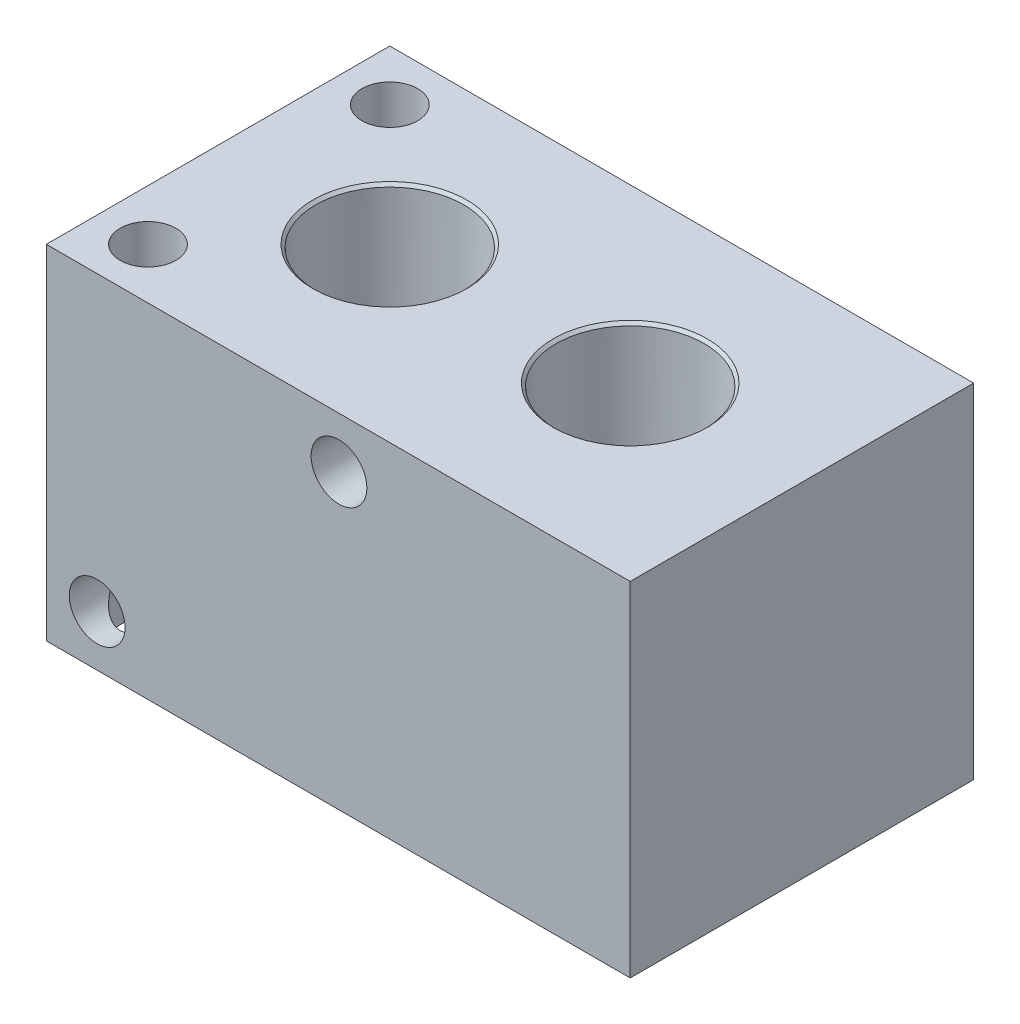
ISO-10303-21;
HEADER;
FILE_DESCRIPTION(('STEP AP214'),'2;1');
FILE_NAME('part.step','',(''),(''),'','','');
FILE_SCHEMA(('AUTOMOTIVE_DESIGN { 1 0 10303 214 1 1 1 1 }'));
ENDSEC;
DATA;
#1=APPLICATION_CONTEXT('core data for automotive mechanical design processes');
#2=APPLICATION_PROTOCOL_DEFINITION('international standard','automotive_design',2000,#1);
#3=PRODUCT_CONTEXT('',#1,'mechanical');
#4=PRODUCT('Part','Part','',(#3));
#5=PRODUCT_RELATED_PRODUCT_CATEGORY('part','',(#4));
#6=PRODUCT_DEFINITION_FORMATION('','',#4);
#7=PRODUCT_DEFINITION_CONTEXT('part definition',#1,'design');
#8=PRODUCT_DEFINITION('design','',#6,#7);
#9=PRODUCT_DEFINITION_SHAPE('','',#8);
#10=(LENGTH_UNIT() NAMED_UNIT(*) SI_UNIT(.MILLI.,.METRE.));
#11=(NAMED_UNIT(*) PLANE_ANGLE_UNIT() SI_UNIT($,.RADIAN.));
#12=(NAMED_UNIT(*) SI_UNIT($,.STERADIAN.) SOLID_ANGLE_UNIT());
#13=UNCERTAINTY_MEASURE_WITH_UNIT(LENGTH_MEASURE(1.E-05),#10,'distance_accuracy_value','');
#14=(GEOMETRIC_REPRESENTATION_CONTEXT(3) GLOBAL_UNCERTAINTY_ASSIGNED_CONTEXT((#13)) GLOBAL_UNIT_ASSIGNED_CONTEXT((#10,
#11,#12)) REPRESENTATION_CONTEXT('',''));
#15=CARTESIAN_POINT('',(0.,0.,0.));
#16=DIRECTION('',(0.,0.,1.));
#17=DIRECTION('',(1.,0.,0.));
#18=AXIS2_PLACEMENT_3D('',#15,#16,#17);
#19=CARTESIAN_POINT('',(-22.2885,-11.176,15.875));
#20=DIRECTION('',(0.,0.,-1.));
#21=DIRECTION('',(-1.,0.,0.));
#22=AXIS2_PLACEMENT_3D('',#19,#20,#21);
#23=CYLINDRICAL_SURFACE('',#22,2.5781);
#24=CARTESIAN_POINT('',(-22.2885,-11.176,-11.176));
#25=DIRECTION('',(0.,0.707106781186547,-0.707106781186547));
#26=DIRECTION('',(0.,-0.707106781186547,-0.707106781186547));
#27=AXIS2_PLACEMENT_3D('',#24,#25,#26);
#28=ELLIPSE('',#27,3.64598398515408,2.5781);
#29=CARTESIAN_POINT('',(-19.7104,-11.176,-11.176));
#30=VERTEX_POINT('',#29);
#31=CARTESIAN_POINT('',(-24.8666,-11.176,-11.176));
#32=VERTEX_POINT('',#31);
#33=EDGE_CURVE('E11',#30,#32,#28,.F.);
#34=ORIENTED_EDGE('',*,*,#33,.F.);
#35=CARTESIAN_POINT('',(-22.2885,-11.176,-11.176));
#36=DIRECTION('',(0.,-0.707106781186547,-0.707106781186547));
#37=DIRECTION('',(0.,0.707106781186547,-0.707106781186547));
#38=AXIS2_PLACEMENT_3D('',#35,#36,#37);
#39=ELLIPSE('',#38,3.64598398515408,2.5781);
#40=EDGE_CURVE('E50',#32,#30,#39,.F.);
#41=ORIENTED_EDGE('',*,*,#40,.F.);
#42=EDGE_LOOP('',(#34,#41));
#43=FACE_BOUND('',#42,.T.);
#44=CARTESIAN_POINT('',(-22.2885,-11.176,11.176));
#45=DIRECTION('',(0.,0.707106781186547,-0.707106781186547));
#46=DIRECTION('',(0.,-0.707106781186547,-0.707106781186547));
#47=AXIS2_PLACEMENT_3D('',#44,#45,#46);
#48=ELLIPSE('',#47,3.64598398515408,2.5781);
#49=CARTESIAN_POINT('',(-19.7104,-11.176,11.176));
#50=VERTEX_POINT('',#49);
#51=CARTESIAN_POINT('',(-24.8666,-11.176,11.176));
#52=VERTEX_POINT('',#51);
#53=EDGE_CURVE('E263',#50,#52,#48,.T.);
#54=ORIENTED_EDGE('',*,*,#53,.F.);
#55=CARTESIAN_POINT('',(-22.2885,-11.176,11.176));
#56=DIRECTION('',(0.,-0.707106781186547,-0.707106781186547));
#57=DIRECTION('',(0.,0.707106781186547,-0.707106781186547));
#58=AXIS2_PLACEMENT_3D('',#55,#56,#57);
#59=ELLIPSE('',#58,3.64598398515408,2.5781);
#60=EDGE_CURVE('E261',#52,#50,#59,.T.);
#61=ORIENTED_EDGE('',*,*,#60,.F.);
#62=EDGE_LOOP('',(#54,#61));
#63=FACE_BOUND('',#62,.T.);
#64=ADVANCED_FACE('F36',(#43,#63),#23,.F.);
#65=CARTESIAN_POINT('',(-22.2885,-11.176,11.176));
#66=DIRECTION('',(0.,0.707106781186547,-0.707106781186547));
#67=DIRECTION('',(0.,-0.707106781186547,-0.707106781186547));
#68=AXIS2_PLACEMENT_3D('',#65,#66,#67);
#69=ELLIPSE('',#68,3.64598398515408,2.5781);
#70=EDGE_CURVE('E265',#50,#52,#69,.F.);
#71=ORIENTED_EDGE('',*,*,#70,.F.);
#72=CARTESIAN_POINT('',(-22.2885,-11.176,11.176));
#73=DIRECTION('',(0.,-0.707106781186547,-0.707106781186547));
#74=DIRECTION('',(0.,0.707106781186547,-0.707106781186547));
#75=AXIS2_PLACEMENT_3D('',#72,#73,#74);
#76=ELLIPSE('',#75,3.64598398515408,2.5781);
#77=EDGE_CURVE('E57',#52,#50,#76,.F.);
#78=ORIENTED_EDGE('',*,*,#77,.F.);
#79=EDGE_LOOP('',(#71,#78));
#80=FACE_BOUND('',#79,.T.);
#81=CARTESIAN_POINT('',(-22.2885,-11.176,15.875));
#82=DIRECTION('',(0.,0.,1.));
#83=DIRECTION('',(1.,0.,0.));
#84=AXIS2_PLACEMENT_3D('',#81,#82,#83);
#85=CIRCLE('',#84,2.5781);
#86=CARTESIAN_POINT('',(-19.7104,-11.176,15.875));
#87=VERTEX_POINT('',#86);
#88=EDGE_CURVE('E219',#87,#87,#85,.T.);
#89=ORIENTED_EDGE('',*,*,#88,.T.);
#90=EDGE_LOOP('',(#89));
#91=FACE_BOUND('',#90,.T.);
#92=ADVANCED_FACE('F285',(#80,#91),#23,.F.);
#93=CARTESIAN_POINT('',(-26.9875,-15.875,15.875));
#94=DIRECTION('',(0.,0.,1.));
#95=DIRECTION('',(1.,0.,0.));
#96=AXIS2_PLACEMENT_3D('',#93,#94,#95);
#97=PLANE('',#96);
#98=CARTESIAN_POINT('',(0.0634999999999976,11.176,15.875));
#99=DIRECTION('',(0.,0.,1.));
#100=DIRECTION('',(1.,0.,0.));
#101=AXIS2_PLACEMENT_3D('',#98,#99,#100);
#102=CIRCLE('',#101,2.5781);
#103=CARTESIAN_POINT('',(2.6416,11.176,15.875));
#104=VERTEX_POINT('',#103);
#105=EDGE_CURVE('E225',#104,#104,#102,.T.);
#106=ORIENTED_EDGE('',*,*,#105,.F.);
#107=EDGE_LOOP('',(#106));
#108=FACE_BOUND('',#107,.T.);
#109=DIRECTION('',(0.,-1.,0.));
#110=VECTOR('',#109,1.);
#111=CARTESIAN_POINT('',(-26.9875,15.875,15.875));
#112=LINE('',#111,#110);
#113=CARTESIAN_POINT('',(-26.9875,15.875,15.875));
#114=VERTEX_POINT('',#113);
#115=CARTESIAN_POINT('',(-26.9875,-15.875,15.875));
#116=VERTEX_POINT('',#115);
#117=EDGE_CURVE('E231',#114,#116,#112,.T.);
#118=ORIENTED_EDGE('',*,*,#117,.T.);
#119=DIRECTION('',(1.,0.,0.));
#120=VECTOR('',#119,1.);
#121=CARTESIAN_POINT('',(-26.9875,-15.875,15.875));
#122=LINE('',#121,#120);
#123=CARTESIAN_POINT('',(26.9875,-15.875,15.875));
#124=VERTEX_POINT('',#123);
#125=EDGE_CURVE('E234',#116,#124,#122,.T.);
#126=ORIENTED_EDGE('',*,*,#125,.T.);
#127=DIRECTION('',(0.,1.,0.));
#128=VECTOR('',#127,1.);
#129=CARTESIAN_POINT('',(26.9875,15.875,15.875));
#130=LINE('',#129,#128);
#131=CARTESIAN_POINT('',(26.9875,15.875,15.875));
#132=VERTEX_POINT('',#131);
#133=EDGE_CURVE('E237',#124,#132,#130,.T.);
#134=ORIENTED_EDGE('',*,*,#133,.T.);
#135=DIRECTION('',(-1.,0.,0.));
#136=VECTOR('',#135,1.);
#137=CARTESIAN_POINT('',(-26.9875,15.875,15.875));
#138=LINE('',#137,#136);
#139=EDGE_CURVE('E239',#132,#114,#138,.T.);
#140=ORIENTED_EDGE('',*,*,#139,.T.);
#141=EDGE_LOOP('',(#118,#126,#134,#140));
#142=FACE_BOUND('',#141,.T.);
#143=ORIENTED_EDGE('',*,*,#88,.F.);
#144=EDGE_LOOP('',(#143));
#145=FACE_BOUND('',#144,.T.);
#146=ADVANCED_FACE('F290',(#108,#142,#145),#97,.T.);
#147=CARTESIAN_POINT('',(-26.9875,-15.875,-15.875));
#148=DIRECTION('',(0.,0.,1.));
#149=DIRECTION('',(1.,0.,0.));
#150=AXIS2_PLACEMENT_3D('',#147,#148,#149);
#151=PLANE('',#150);
#152=CARTESIAN_POINT('',(0.0634999999999976,11.176,-15.875));
#153=DIRECTION('',(0.,0.,1.));
#154=DIRECTION('',(1.,0.,0.));
#155=AXIS2_PLACEMENT_3D('',#152,#153,#154);
#156=CIRCLE('',#155,2.5781);
#157=CARTESIAN_POINT('',(2.6416,11.176,-15.875));
#158=VERTEX_POINT('',#157);
#159=EDGE_CURVE('E222',#158,#158,#156,.T.);
#160=ORIENTED_EDGE('',*,*,#159,.T.);
#161=EDGE_LOOP('',(#160));
#162=FACE_BOUND('',#161,.T.);
#163=DIRECTION('',(0.,-1.,0.));
#164=VECTOR('',#163,1.);
#165=CARTESIAN_POINT('',(-26.9875,15.875,-15.875));
#166=LINE('',#165,#164);
#167=CARTESIAN_POINT('',(-26.9875,15.875,-15.875));
#168=VERTEX_POINT('',#167);
#169=CARTESIAN_POINT('',(-26.9875,-15.875,-15.875));
#170=VERTEX_POINT('',#169);
#171=EDGE_CURVE('E228',#168,#170,#166,.T.);
#172=ORIENTED_EDGE('',*,*,#171,.F.);
#173=DIRECTION('',(-1.,0.,0.));
#174=VECTOR('',#173,1.);
#175=CARTESIAN_POINT('',(-26.9875,15.875,-15.875));
#176=LINE('',#175,#174);
#177=CARTESIAN_POINT('',(26.9875,15.875,-15.875));
#178=VERTEX_POINT('',#177);
#179=EDGE_CURVE('E235',#178,#168,#176,.T.);
#180=ORIENTED_EDGE('',*,*,#179,.F.);
#181=DIRECTION('',(0.,1.,0.));
#182=VECTOR('',#181,1.);
#183=CARTESIAN_POINT('',(26.9875,15.875,-15.875));
#184=LINE('',#183,#182);
#185=CARTESIAN_POINT('',(26.9875,-15.875,-15.875));
#186=VERTEX_POINT('',#185);
#187=EDGE_CURVE('E246',#186,#178,#184,.T.);
#188=ORIENTED_EDGE('',*,*,#187,.F.);
#189=DIRECTION('',(1.,0.,0.));
#190=VECTOR('',#189,1.);
#191=CARTESIAN_POINT('',(-26.9875,-15.875,-15.875));
#192=LINE('',#191,#190);
#193=EDGE_CURVE('E244',#170,#186,#192,.T.);
#194=ORIENTED_EDGE('',*,*,#193,.F.);
#195=EDGE_LOOP('',(#172,#180,#188,#194));
#196=FACE_BOUND('',#195,.T.);
#197=CARTESIAN_POINT('',(-22.2885,-11.176,-15.875));
#198=DIRECTION('',(0.,0.,1.));
#199=DIRECTION('',(1.,0.,0.));
#200=AXIS2_PLACEMENT_3D('',#197,#198,#199);
#201=CIRCLE('',#200,2.5781);
#202=CARTESIAN_POINT('',(-19.7104,-11.176,-15.875));
#203=VERTEX_POINT('',#202);
#204=EDGE_CURVE('E216',#203,#203,#201,.T.);
#205=ORIENTED_EDGE('',*,*,#204,.T.);
#206=EDGE_LOOP('',(#205));
#207=FACE_BOUND('',#206,.T.);
#208=ADVANCED_FACE('F288',(#162,#196,#207),#151,.F.);
#209=CARTESIAN_POINT('',(-26.9875,15.875,15.875));
#210=DIRECTION('',(1.,0.,0.));
#211=DIRECTION('',(0.,1.,0.));
#212=AXIS2_PLACEMENT_3D('',#209,#210,#211);
#213=PLANE('',#212);
#214=ORIENTED_EDGE('',*,*,#171,.T.);
#215=DIRECTION('',(0.,0.,-1.));
#216=VECTOR('',#215,1.);
#217=CARTESIAN_POINT('',(-26.9875,-15.875,15.875));
#218=LINE('',#217,#216);
#219=EDGE_CURVE('E257',#116,#170,#218,.T.);
#220=ORIENTED_EDGE('',*,*,#219,.F.);
#221=ORIENTED_EDGE('',*,*,#117,.F.);
#222=DIRECTION('',(0.,0.,-1.));
#223=VECTOR('',#222,1.);
#224=CARTESIAN_POINT('',(-26.9875,15.875,15.875));
#225=LINE('',#224,#223);
#226=EDGE_CURVE('E241',#114,#168,#225,.T.);
#227=ORIENTED_EDGE('',*,*,#226,.T.);
#228=EDGE_LOOP('',(#214,#220,#221,#227));
#229=FACE_BOUND('',#228,.T.);
#230=ADVANCED_FACE('F38',(#229),#213,.F.);
#231=CARTESIAN_POINT('',(-26.9875,-15.875,15.875));
#232=DIRECTION('',(0.,1.,0.));
#233=DIRECTION('',(0.,0.,1.));
#234=AXIS2_PLACEMENT_3D('',#231,#232,#233);
#235=PLANE('',#234);
#236=CARTESIAN_POINT('',(0.,-15.875,0.));
#237=DIRECTION('',(0.,-1.,0.));
#238=DIRECTION('',(1.,0.,0.));
#239=AXIS2_PLACEMENT_3D('',#236,#237,#238);
#240=CIRCLE('',#239,8.6995);
#241=CARTESIAN_POINT('',(8.6995,-15.875,0.));
#242=VERTEX_POINT('',#241);
#243=EDGE_CURVE('E137',#242,#242,#240,.T.);
#244=ORIENTED_EDGE('',*,*,#243,.F.);
#245=EDGE_LOOP('',(#244));
#246=FACE_BOUND('',#245,.T.);
#247=CARTESIAN_POINT('',(-22.2885,-15.875,-11.176));
#248=DIRECTION('',(0.,1.,0.));
#249=DIRECTION('',(0.,0.,1.));
#250=AXIS2_PLACEMENT_3D('',#247,#248,#249);
#251=CIRCLE('',#250,2.5781);
#252=CARTESIAN_POINT('',(-22.2885,-15.875,-8.5979));
#253=VERTEX_POINT('',#252);
#254=EDGE_CURVE('E207',#253,#253,#251,.T.);
#255=ORIENTED_EDGE('',*,*,#254,.T.);
#256=EDGE_LOOP('',(#255));
#257=FACE_BOUND('',#256,.T.);
#258=CARTESIAN_POINT('',(-22.2885,-15.875,11.176));
#259=DIRECTION('',(0.,1.,0.));
#260=DIRECTION('',(0.,0.,1.));
#261=AXIS2_PLACEMENT_3D('',#258,#259,#260);
#262=CIRCLE('',#261,2.5781);
#263=CARTESIAN_POINT('',(-22.2885,-15.875,13.7541));
#264=VERTEX_POINT('',#263);
#265=EDGE_CURVE('E213',#264,#264,#262,.T.);
#266=ORIENTED_EDGE('',*,*,#265,.T.);
#267=EDGE_LOOP('',(#266));
#268=FACE_BOUND('',#267,.T.);
#269=ORIENTED_EDGE('',*,*,#193,.T.);
#270=DIRECTION('',(0.,0.,-1.));
#271=VECTOR('',#270,1.);
#272=CARTESIAN_POINT('',(26.9875,-15.875,15.875));
#273=LINE('',#272,#271);
#274=EDGE_CURVE('E254',#124,#186,#273,.T.);
#275=ORIENTED_EDGE('',*,*,#274,.F.);
#276=ORIENTED_EDGE('',*,*,#125,.F.);
#277=ORIENTED_EDGE('',*,*,#219,.T.);
#278=EDGE_LOOP('',(#269,#275,#276,#277));
#279=FACE_BOUND('',#278,.T.);
#280=ADVANCED_FACE('F297',(#246,#257,#268,#279),#235,.F.);
#281=CARTESIAN_POINT('',(26.9875,15.875,15.875));
#282=DIRECTION('',(-1.,0.,0.));
#283=DIRECTION('',(0.,-1.,0.));
#284=AXIS2_PLACEMENT_3D('',#281,#282,#283);
#285=PLANE('',#284);
#286=ORIENTED_EDGE('',*,*,#187,.T.);
#287=DIRECTION('',(0.,0.,-1.));
#288=VECTOR('',#287,1.);
#289=CARTESIAN_POINT('',(26.9875,15.875,15.875));
#290=LINE('',#289,#288);
#291=EDGE_CURVE('E251',#132,#178,#290,.T.);
#292=ORIENTED_EDGE('',*,*,#291,.F.);
#293=ORIENTED_EDGE('',*,*,#133,.F.);
#294=ORIENTED_EDGE('',*,*,#274,.T.);
#295=EDGE_LOOP('',(#286,#292,#293,#294));
#296=FACE_BOUND('',#295,.T.);
#297=ADVANCED_FACE('F318',(#296),#285,.F.);
#298=CARTESIAN_POINT('',(-26.9875,15.875,15.875));
#299=DIRECTION('',(0.,-1.,0.));
#300=DIRECTION('',(0.,0.,-1.));
#301=AXIS2_PLACEMENT_3D('',#298,#299,#300);
#302=PLANE('',#301);
#303=CARTESIAN_POINT('',(11.1125,15.875,0.));
#304=DIRECTION('',(0.,1.,0.));
#305=DIRECTION('',(0.,0.,1.));
#306=AXIS2_PLACEMENT_3D('',#303,#304,#305);
#307=CIRCLE('',#306,7.112);
#308=CARTESIAN_POINT('',(11.1125,15.875,7.112));
#309=VERTEX_POINT('',#308);
#310=EDGE_CURVE('E191',#309,#309,#307,.T.);
#311=ORIENTED_EDGE('',*,*,#310,.F.);
#312=EDGE_LOOP('',(#311));
#313=FACE_BOUND('',#312,.T.);
#314=CARTESIAN_POINT('',(-11.1125,15.875,0.));
#315=DIRECTION('',(0.,1.,0.));
#316=DIRECTION('',(0.,0.,1.));
#317=AXIS2_PLACEMENT_3D('',#314,#315,#316);
#318=CIRCLE('',#317,7.112);
#319=CARTESIAN_POINT('',(-11.1125,15.875,7.112));
#320=VERTEX_POINT('',#319);
#321=EDGE_CURVE('E165',#320,#320,#318,.T.);
#322=ORIENTED_EDGE('',*,*,#321,.F.);
#323=EDGE_LOOP('',(#322));
#324=FACE_BOUND('',#323,.T.);
#325=CARTESIAN_POINT('',(-22.2885,15.875,-11.176));
#326=DIRECTION('',(0.,1.,0.));
#327=DIRECTION('',(0.,0.,1.));
#328=AXIS2_PLACEMENT_3D('',#325,#326,#327);
#329=CIRCLE('',#328,2.5781);
#330=CARTESIAN_POINT('',(-22.2885,15.875,-8.5979));
#331=VERTEX_POINT('',#330);
#332=EDGE_CURVE('E206',#331,#331,#329,.T.);
#333=ORIENTED_EDGE('',*,*,#332,.F.);
#334=EDGE_LOOP('',(#333));
#335=FACE_BOUND('',#334,.T.);
#336=CARTESIAN_POINT('',(-22.2885,15.875,11.176));
#337=DIRECTION('',(0.,1.,0.));
#338=DIRECTION('',(0.,0.,1.));
#339=AXIS2_PLACEMENT_3D('',#336,#337,#338);
#340=CIRCLE('',#339,2.5781);
#341=CARTESIAN_POINT('',(-22.2885,15.875,13.7541));
#342=VERTEX_POINT('',#341);
#343=EDGE_CURVE('E210',#342,#342,#340,.T.);
#344=ORIENTED_EDGE('',*,*,#343,.F.);
#345=EDGE_LOOP('',(#344));
#346=FACE_BOUND('',#345,.T.);
#347=ORIENTED_EDGE('',*,*,#179,.T.);
#348=ORIENTED_EDGE('',*,*,#226,.F.);
#349=ORIENTED_EDGE('',*,*,#139,.F.);
#350=ORIENTED_EDGE('',*,*,#291,.T.);
#351=EDGE_LOOP('',(#347,#348,#349,#350));
#352=FACE_BOUND('',#351,.T.);
#353=ADVANCED_FACE('F313',(#313,#324,#335,#346,#352),#302,.F.);
#354=CARTESIAN_POINT('',(0.0634999999999976,11.176,15.875));
#355=DIRECTION('',(0.,0.,-1.));
#356=DIRECTION('',(-1.,0.,0.));
#357=AXIS2_PLACEMENT_3D('',#354,#355,#356);
#358=CYLINDRICAL_SURFACE('',#357,2.5781);
#359=ORIENTED_EDGE('',*,*,#105,.T.);
#360=EDGE_LOOP('',(#359));
#361=FACE_BOUND('',#360,.T.);
#362=ORIENTED_EDGE('',*,*,#159,.F.);
#363=EDGE_LOOP('',(#362));
#364=FACE_BOUND('',#363,.T.);
#365=ADVANCED_FACE('F283',(#361,#364),#358,.F.);
#366=CARTESIAN_POINT('',(-22.2885,-11.176,-11.176));
#367=DIRECTION('',(0.,0.707106781186547,-0.707106781186547));
#368=DIRECTION('',(0.,-0.707106781186547,-0.707106781186547));
#369=AXIS2_PLACEMENT_3D('',#366,#367,#368);
#370=ELLIPSE('',#369,3.64598398515408,2.5781);
#371=EDGE_CURVE('E44',#30,#32,#370,.T.);
#372=ORIENTED_EDGE('',*,*,#371,.F.);
#373=CARTESIAN_POINT('',(-22.2885,-11.176,-11.176));
#374=DIRECTION('',(0.,-0.707106781186547,-0.707106781186547));
#375=DIRECTION('',(0.,0.707106781186547,-0.707106781186547));
#376=AXIS2_PLACEMENT_3D('',#373,#374,#375);
#377=ELLIPSE('',#376,3.64598398515408,2.5781);
#378=EDGE_CURVE('E269',#32,#30,#377,.T.);
#379=ORIENTED_EDGE('',*,*,#378,.F.);
#380=EDGE_LOOP('',(#372,#379));
#381=FACE_BOUND('',#380,.T.);
#382=ORIENTED_EDGE('',*,*,#204,.F.);
#383=EDGE_LOOP('',(#382));
#384=FACE_BOUND('',#383,.T.);
#385=ADVANCED_FACE('F279',(#381,#384),#23,.F.);
#386=CARTESIAN_POINT('',(-22.2885,-15.875,11.176));
#387=DIRECTION('',(0.,1.,0.));
#388=DIRECTION('',(0.,0.,1.));
#389=AXIS2_PLACEMENT_3D('',#386,#387,#388);
#390=CYLINDRICAL_SURFACE('',#389,2.5781);
#391=ORIENTED_EDGE('',*,*,#53,.T.);
#392=ORIENTED_EDGE('',*,*,#77,.T.);
#393=EDGE_LOOP('',(#391,#392));
#394=FACE_BOUND('',#393,.T.);
#395=ORIENTED_EDGE('',*,*,#265,.F.);
#396=EDGE_LOOP('',(#395));
#397=FACE_BOUND('',#396,.T.);
#398=ADVANCED_FACE('F282',(#394,#397),#390,.F.);
#399=ORIENTED_EDGE('',*,*,#70,.T.);
#400=ORIENTED_EDGE('',*,*,#60,.T.);
#401=EDGE_LOOP('',(#399,#400));
#402=FACE_BOUND('',#401,.T.);
#403=ORIENTED_EDGE('',*,*,#343,.T.);
#404=EDGE_LOOP('',(#403));
#405=FACE_BOUND('',#404,.T.);
#406=ADVANCED_FACE('F310',(#402,#405),#390,.F.);
#407=CARTESIAN_POINT('',(-22.2885,-15.875,-11.176));
#408=DIRECTION('',(0.,1.,0.));
#409=DIRECTION('',(0.,0.,1.));
#410=AXIS2_PLACEMENT_3D('',#407,#408,#409);
#411=CYLINDRICAL_SURFACE('',#410,2.5781);
#412=ORIENTED_EDGE('',*,*,#371,.T.);
#413=ORIENTED_EDGE('',*,*,#40,.T.);
#414=EDGE_LOOP('',(#412,#413));
#415=FACE_BOUND('',#414,.T.);
#416=ORIENTED_EDGE('',*,*,#254,.F.);
#417=EDGE_LOOP('',(#416));
#418=FACE_BOUND('',#417,.T.);
#419=ADVANCED_FACE('F272',(#415,#418),#411,.F.);
#420=ORIENTED_EDGE('',*,*,#33,.T.);
#421=ORIENTED_EDGE('',*,*,#378,.T.);
#422=EDGE_LOOP('',(#420,#421));
#423=FACE_BOUND('',#422,.T.);
#424=ORIENTED_EDGE('',*,*,#332,.T.);
#425=EDGE_LOOP('',(#424));
#426=FACE_BOUND('',#425,.T.);
#427=ADVANCED_FACE('F277',(#423,#426),#411,.F.);
#428=CARTESIAN_POINT('',(11.1125,-11.3160795010063,0.));
#429=DIRECTION('',(0.,1.,0.));
#430=DIRECTION('',(0.,0.,1.));
#431=AXIS2_PLACEMENT_3D('',#428,#429,#430);
#432=CYLINDRICAL_SURFACE('',#431,4.00083827580381);
#433=CARTESIAN_POINT('',(11.1125,5.66928,0.));
#434=DIRECTION('',(0.,1.,0.));
#435=DIRECTION('',(0.,0.,1.));
#436=AXIS2_PLACEMENT_3D('',#433,#434,#435);
#437=CIRCLE('',#436,4.00083827580381);
#438=CARTESIAN_POINT('',(11.1125,5.66928,4.00083827580381));
#439=VERTEX_POINT('',#438);
#440=EDGE_CURVE('E200',#439,#439,#437,.F.);
#441=ORIENTED_EDGE('',*,*,#440,.F.);
#442=EDGE_LOOP('',(#441));
#443=FACE_BOUND('',#442,.T.);
#444=CARTESIAN_POINT('',(11.1125,0.,0.));
#445=DIRECTION('',(0.707106781186548,0.707106781186547,0.));
#446=DIRECTION('',(-0.707106781186548,0.707106781186547,0.));
#447=AXIS2_PLACEMENT_3D('',#444,#445,#446);
#448=ELLIPSE('',#447,5.65803975050313,4.00083827580381);
#449=CARTESIAN_POINT('',(11.1125,0.,4.00083827580381));
#450=VERTEX_POINT('',#449);
#451=CARTESIAN_POINT('',(11.1125,0.,-4.00083827580381));
#452=VERTEX_POINT('',#451);
#453=EDGE_CURVE('E178',#450,#452,#448,.F.);
#454=ORIENTED_EDGE('',*,*,#453,.T.);
#455=CARTESIAN_POINT('',(11.1125,0.,0.));
#456=DIRECTION('',(0.,1.,0.));
#457=DIRECTION('',(0.,0.,1.));
#458=AXIS2_PLACEMENT_3D('',#455,#456,#457);
#459=CIRCLE('',#458,4.00083827580381);
#460=EDGE_CURVE('E188',#452,#450,#459,.F.);
#461=ORIENTED_EDGE('',*,*,#460,.T.);
#462=EDGE_LOOP('',(#454,#461));
#463=FACE_BOUND('',#462,.T.);
#464=ADVANCED_FACE('F371',(#443,#463),#432,.F.);
#465=CARTESIAN_POINT('',(11.1125,5.66928,0.));
#466=DIRECTION('',(0.,1.,0.));
#467=DIRECTION('',(0.,0.,1.));
#468=AXIS2_PLACEMENT_3D('',#465,#466,#467);
#469=PLANE('',#468);
#470=CARTESIAN_POINT('',(11.1125,5.66928,0.));
#471=DIRECTION('',(0.,1.,0.));
#472=DIRECTION('',(0.,0.,1.));
#473=AXIS2_PLACEMENT_3D('',#470,#471,#472);
#474=CIRCLE('',#473,6.54083827580381);
#475=CARTESIAN_POINT('',(11.1125,5.66928,6.54083827580381));
#476=VERTEX_POINT('',#475);
#477=EDGE_CURVE('E194',#476,#476,#474,.T.);
#478=ORIENTED_EDGE('',*,*,#477,.T.);
#479=EDGE_LOOP('',(#478));
#480=FACE_BOUND('',#479,.T.);
#481=ORIENTED_EDGE('',*,*,#440,.T.);
#482=EDGE_LOOP('',(#481));
#483=FACE_BOUND('',#482,.T.);
#484=ADVANCED_FACE('F377',(#480,#483),#469,.T.);
#485=CARTESIAN_POINT('',(11.1125,15.875,0.));
#486=DIRECTION('',(0.,1.,0.));
#487=DIRECTION('',(0.,0.,1.));
#488=AXIS2_PLACEMENT_3D('',#485,#486,#487);
#489=CONICAL_SURFACE('',#488,6.858,0.0310668606854991);
#490=CARTESIAN_POINT('',(11.1125,15.6128533040208,0.));
#491=DIRECTION('',(0.,1.,0.));
#492=DIRECTION('',(0.,0.,1.));
#493=AXIS2_PLACEMENT_3D('',#490,#491,#492);
#494=CIRCLE('',#493,6.84985330402077);
#495=CARTESIAN_POINT('',(11.1125,15.6128533040208,6.84985330402077));
#496=VERTEX_POINT('',#495);
#497=EDGE_CURVE('E197',#496,#496,#494,.T.);
#498=ORIENTED_EDGE('',*,*,#497,.T.);
#499=EDGE_LOOP('',(#498));
#500=FACE_BOUND('',#499,.T.);
#501=ORIENTED_EDGE('',*,*,#477,.F.);
#502=EDGE_LOOP('',(#501));
#503=FACE_BOUND('',#502,.T.);
#504=ADVANCED_FACE('F373',(#500,#503),#489,.F.);
#505=CARTESIAN_POINT('',(11.1125,15.875,0.));
#506=DIRECTION('',(0.,1.,0.));
#507=DIRECTION('',(0.,0.,1.));
#508=AXIS2_PLACEMENT_3D('',#505,#506,#507);
#509=CONICAL_SURFACE('',#508,7.112,0.78539816339745);
#510=ORIENTED_EDGE('',*,*,#497,.F.);
#511=EDGE_LOOP('',(#510));
#512=FACE_BOUND('',#511,.T.);
#513=ORIENTED_EDGE('',*,*,#310,.T.);
#514=EDGE_LOOP('',(#513));
#515=FACE_BOUND('',#514,.T.);
#516=ADVANCED_FACE('F376',(#512,#515),#509,.F.);
#517=CARTESIAN_POINT('',(11.1125,0.,0.));
#518=DIRECTION('',(0.,0.,-1.));
#519=DIRECTION('',(0.,-1.,0.));
#520=AXIS2_PLACEMENT_3D('',#517,#518,#519);
#521=SPHERICAL_SURFACE('',#520,4.00083827580381);
#522=ORIENTED_EDGE('',*,*,#460,.F.);
#523=CARTESIAN_POINT('',(11.1125,0.,0.));
#524=DIRECTION('',(1.,0.,0.));
#525=DIRECTION('',(0.,0.,-1.));
#526=AXIS2_PLACEMENT_3D('',#523,#524,#525);
#527=CIRCLE('',#526,4.00083827580381);
#528=EDGE_CURVE('E203',#450,#452,#527,.T.);
#529=ORIENTED_EDGE('',*,*,#528,.F.);
#530=EDGE_LOOP('',(#522,#529));
#531=FACE_BOUND('',#530,.T.);
#532=ADVANCED_FACE('F384',(#531),#521,.F.);
#533=CARTESIAN_POINT('',(11.1125,0.,0.));
#534=DIRECTION('',(-1.,0.,0.));
#535=DIRECTION('',(0.,0.,1.));
#536=AXIS2_PLACEMENT_3D('',#533,#534,#535);
#537=CYLINDRICAL_SURFACE('',#536,4.00083827580381);
#538=DIRECTION('',(-1.,0.,0.));
#539=VECTOR('',#538,1.);
#540=CARTESIAN_POINT('',(11.1125,0.,-4.00083827580381));
#541=LINE('',#540,#539);
#542=CARTESIAN_POINT('',(-1.57445749114241,0.,-4.00083827580381));
#543=VERTEX_POINT('',#542);
#544=CARTESIAN_POINT('',(1.57445749114242,0.,-4.00083827580381));
#545=VERTEX_POINT('',#544);
#546=EDGE_CURVE('E122',#543,#545,#541,.F.);
#547=ORIENTED_EDGE('',*,*,#546,.T.);
#548=CARTESIAN_POINT('',(1.57445749114242,0.,4.00083827580381));
#549=CARTESIAN_POINT('',(1.57438958883669,-0.0547086162398053,4.00085258124359));
#550=CARTESIAN_POINT('',(1.57730777333186,-0.109365537077072,3.99971682566847));
#551=CARTESIAN_POINT('',(1.58856217606203,-0.217846015236129,3.99526663206269));
#552=CARTESIAN_POINT('',(1.59687961384853,-0.271671801590939,3.9919597455149));
#553=CARTESIAN_POINT('',(1.61816476215537,-0.377053912405152,3.98337619124058));
#554=CARTESIAN_POINT('',(1.63103357132395,-0.428634141479594,3.97814132553361));
#555=CARTESIAN_POINT('',(1.66070273139877,-0.530460388219912,3.96584793173234));
#556=CARTESIAN_POINT('',(1.67750681464132,-0.580705088539603,3.95878767171194));
#557=CARTESIAN_POINT('',(1.72443880724,-0.707013103039072,3.93864074477427));
#558=CARTESIAN_POINT('',(1.75680720162421,-0.782052646553533,3.9243767618051));
#559=CARTESIAN_POINT('',(1.8268544905877,-0.928785032131232,3.8922633144291));
#560=CARTESIAN_POINT('',(1.86453659564218,-1.00047581579778,3.87441167961644));
#561=CARTESIAN_POINT('',(1.94397696204086,-1.14174509379795,3.8351744286963));
#562=CARTESIAN_POINT('',(1.98577910230351,-1.21128744258151,3.81374859206367));
#563=CARTESIAN_POINT('',(2.07184663058573,-1.34774772842885,3.76768706562433));
#564=CARTESIAN_POINT('',(2.11611297022352,-1.41466463435933,3.74305013076798));
#565=CARTESIAN_POINT('',(2.24716803511496,-1.60601820205928,3.66684065548309));
#566=CARTESIAN_POINT('',(2.33601728714365,-1.72742131019266,3.61114815473631));
#567=CARTESIAN_POINT('',(2.51541259080398,-1.96320278139639,3.48857870056538));
#568=CARTESIAN_POINT('',(2.60595985576549,-2.07757585043063,3.42169345608176));
#569=CARTESIAN_POINT('',(2.78586660655614,-2.29919546599971,3.27686615193929));
#570=CARTESIAN_POINT('',(2.87522935121379,-2.40646811450608,3.19896832062139));
#571=CARTESIAN_POINT('',(3.05108718876243,-2.61404602147806,3.03170302822776));
#572=CARTESIAN_POINT('',(3.13758388609065,-2.71435521380472,2.94234212559361));
#573=CARTESIAN_POINT('',(3.34638565803665,-2.9536888937316,2.70605039004665));
#574=CARTESIAN_POINT('',(3.46599563831042,-3.0882412368147,2.55204746053486));
#575=CARTESIAN_POINT('',(3.68889401538551,-3.33645957276173,2.21765351175802));
#576=CARTESIAN_POINT('',(3.79220269544213,-3.45015155075376,2.03729583214489));
#577=CARTESIAN_POINT('',(3.95664398673225,-3.63003439822558,1.69095298763312));
#578=CARTESIAN_POINT('',(4.02208093676939,-3.70118572164595,1.5296483325185));
#579=CARTESIAN_POINT('',(4.10626440618753,-3.79244329408255,1.27753562570533));
#580=CARTESIAN_POINT('',(4.13200145382497,-3.82028912988035,1.19178338459098));
#581=CARTESIAN_POINT('',(4.17837117753196,-3.87039534587894,1.01733407306734));
#582=CARTESIAN_POINT('',(4.19900610831835,-3.89265819336443,0.928638323173026));
#583=CARTESIAN_POINT('',(4.23490168729426,-3.93135197664413,0.748172045912462));
#584=CARTESIAN_POINT('',(4.25011989581859,-3.94773686656649,0.656383151374175));
#585=CARTESIAN_POINT('',(4.2746190036711,-3.97410053006846,0.471145075252064));
#586=CARTESIAN_POINT('',(4.28390270020887,-3.98408232173178,0.377696697238991));
#587=CARTESIAN_POINT('',(4.29632382331888,-3.99743517985247,0.189935237631335));
#588=CARTESIAN_POINT('',(4.29946224054578,-4.0008073118254,0.0956222978723362));
#589=CARTESIAN_POINT('',(4.29951946272045,-4.00086881055332,-0.0930013753427681));
#590=CARTESIAN_POINT('',(4.29643883578994,-3.99755878773606,-0.187312108213428));
#591=CARTESIAN_POINT('',(4.2848337667749,-3.98508325678495,-0.364383441500669));
#592=CARTESIAN_POINT('',(4.27696787320675,-3.97662605160776,-0.44723845630607));
#593=CARTESIAN_POINT('',(4.25656199203772,-3.95467058860172,-0.611705002603115));
#594=CARTESIAN_POINT('',(4.24402047714191,-3.94117068356867,-0.69331611869747));
#595=CARTESIAN_POINT('',(4.19969573596408,-3.89341401352946,-0.9354245223808));
#596=CARTESIAN_POINT('',(4.16120179451564,-3.85188905198827,-1.09334905744024));
#597=CARTESIAN_POINT('',(4.06707625440681,-3.75001167411525,-1.40424402847049));
#598=CARTESIAN_POINT('',(4.01087725644604,-3.68903491998556,-1.55683106954645));
#599=CARTESIAN_POINT('',(3.88493290635134,-3.55169381087057,-1.84885169953619));
#600=CARTESIAN_POINT('',(3.81517964393964,-3.47532046944693,-1.98827753662201));
#601=CARTESIAN_POINT('',(3.62566133043706,-3.26640217261058,-2.32248687463343));
#602=CARTESIAN_POINT('',(3.49883053128768,-3.12538102752595,-2.5080425701162));
#603=CARTESIAN_POINT('',(3.29710516004734,-2.89710840952328,-2.761608721569));
#604=CARTESIAN_POINT('',(3.22783673990793,-2.81809522136062,-2.84210571885216));
#605=CARTESIAN_POINT('',(3.08643864356859,-2.65496681458975,-2.99505280158895));
#606=CARTESIAN_POINT('',(3.01430942849422,-2.57085241708772,-3.06750417680318));
#607=CARTESIAN_POINT('',(2.86648251064422,-2.39584162863201,-3.20615388611892));
#608=CARTESIAN_POINT('',(2.79074069910067,-2.30483059846362,-3.27215927107245));
#609=CARTESIAN_POINT('',(2.63854924202951,-2.11801053536041,-3.3960716748452));
#610=CARTESIAN_POINT('',(2.56209958146814,-2.02220140032883,-3.45397852123967));
#611=CARTESIAN_POINT('',(2.40990216712208,-1.82554285371021,-3.56183873771856));
#612=CARTESIAN_POINT('',(2.33415494947652,-1.72468991638086,-3.61178643910999));
#613=CARTESIAN_POINT('',(2.18548441135894,-1.51745048141374,-3.70363243316411));
#614=CARTESIAN_POINT('',(2.11255925594959,-1.41106768851356,-3.74553602887421));
#615=CARTESIAN_POINT('',(1.97614814233684,-1.19697308826279,-3.81918347324598));
#616=CARTESIAN_POINT('',(1.91237427316757,-1.08958432894304,-3.85132582267322));
#617=CARTESIAN_POINT('',(1.79538336428865,-0.867914514235887,-3.90721960747589));
#618=CARTESIAN_POINT('',(1.74208610394352,-0.753695332471378,-3.93103598712378));
#619=CARTESIAN_POINT('',(1.67912904939756,-0.585387342837542,-3.95810289041568));
#620=CARTESIAN_POINT('',(1.66205438160005,-0.534709259647643,-3.96528310211426));
#621=CARTESIAN_POINT('',(1.63190309196108,-0.431981091314357,-3.97778541085167));
#622=CARTESIAN_POINT('',(1.61882285898178,-0.379932291881986,-3.98310918680842));
#623=CARTESIAN_POINT('',(1.5972122426281,-0.273685567711833,-3.99182729336863));
#624=CARTESIAN_POINT('',(1.58877230757312,-0.219465624741873,-3.99518334708317));
#625=CARTESIAN_POINT('',(1.57735048144238,-0.110183262419022,-3.99969998571068));
#626=CARTESIAN_POINT('',(1.5743874628851,-0.0551185868221716,-4.00085297971447));
#627=CARTESIAN_POINT('',(1.57445749114352,3.99271945530841E-13,-4.00083827580389));
#628=B_SPLINE_CURVE_WITH_KNOTS('',3,(#548,#549,#550,#551,#552,#553,#554,#555,#556,#557,#558,
#559,#560,#561,#562,#563,#564,#565,#566,#567,#568,#569,#570,#571,#572,#573,#574,#575,#576,#577,
#578,#579,#580,#581,#582,#583,#584,#585,#586,#587,#588,#589,#590,#591,#592,#593,#594,#595,#596,
#597,#598,#599,#600,#601,#602,#603,#604,#605,#606,#607,#608,#609,#610,#611,#612,#613,#614,#615,
#616,#617,#618,#619,#620,#621,#622,#623,#624,#625,#626,#627),.UNSPECIFIED.,.F.,.F.,(4,2,2,2,2,2,
2,2,2,2,2,2,2,2,2,2,2,2,2,2,2,2,2,2,2,2,2,2,2,2,2,2,2,2,2,2,2,2,2,4),(0.,0.163953874746456,
0.327340495724388,0.487375224255005,0.647562353838034,0.895988114507523,1.14456461907738,
1.39615475074839,1.64784272410924,2.12842036315649,2.60935558029886,3.08841143532063,
3.56719441735119,4.27532887833316,4.98257515844834,5.54427524533406,5.82526174880591,
6.10612385647898,6.38914042266247,6.67202349151278,6.95486095421601,7.2376725803394,
7.48833950965305,7.73908839133652,8.24013286264175,8.75922650739009,9.27862401034506,
10.0699122243568,10.46675789562,10.8635398580691,11.2698912017957,11.6762511957697,
12.0828993277844,12.4892784508661,12.8756586897085,13.2589540635826,13.4206659138084,
13.5822311339184,13.7468430102656,13.9120210611167),.UNSPECIFIED.);
#629=CARTESIAN_POINT('',(1.57445749114242,0.,4.0008382758038));
#630=VERTEX_POINT('',#629);
#631=EDGE_CURVE('E126',#630,#545,#628,.T.);
#632=ORIENTED_EDGE('',*,*,#631,.F.);
#633=DIRECTION('',(-1.,0.,0.));
#634=VECTOR('',#633,1.);
#635=CARTESIAN_POINT('',(11.1125,0.,4.00083827580381));
#636=LINE('',#635,#634);
#637=CARTESIAN_POINT('',(-1.57445749114242,0.,4.0008382758038));
#638=VERTEX_POINT('',#637);
#639=EDGE_CURVE('E115',#630,#638,#636,.T.);
#640=ORIENTED_EDGE('',*,*,#639,.T.);
#641=CARTESIAN_POINT('',(-1.57445749114241,0.,-4.00083827580381));
#642=CARTESIAN_POINT('',(-1.57438958883668,-0.0547086162398055,-4.00085258124359));
#643=CARTESIAN_POINT('',(-1.57730777333185,-0.109365537077072,-3.99971682566847));
#644=CARTESIAN_POINT('',(-1.58856217606203,-0.217846015236128,-3.9952666320627));
#645=CARTESIAN_POINT('',(-1.59687961384852,-0.271671801590938,-3.9919597455149));
#646=CARTESIAN_POINT('',(-1.61816476215536,-0.377053912405151,-3.98337619124058));
#647=CARTESIAN_POINT('',(-1.63103357132395,-0.428634141479595,-3.97814132553361));
#648=CARTESIAN_POINT('',(-1.66070273139877,-0.530460388219913,-3.96584793173234));
#649=CARTESIAN_POINT('',(-1.67750681464132,-0.580705088539602,-3.95878767171194));
#650=CARTESIAN_POINT('',(-1.72443880724,-0.70701310303907,-3.93864074477427));
#651=CARTESIAN_POINT('',(-1.75680720162421,-0.782052646553533,-3.9243767618051));
#652=CARTESIAN_POINT('',(-1.82685449058769,-0.928785032131232,-3.8922633144291));
#653=CARTESIAN_POINT('',(-1.86453659564217,-1.00047581579778,-3.87441167961644));
#654=CARTESIAN_POINT('',(-1.94397696204086,-1.14174509379795,-3.8351744286963));
#655=CARTESIAN_POINT('',(-1.98577910230351,-1.21128744258151,-3.81374859206367));
#656=CARTESIAN_POINT('',(-2.07184663058573,-1.34774772842885,-3.76768706562433));
#657=CARTESIAN_POINT('',(-2.11611297022351,-1.41466463435933,-3.74305013076798));
#658=CARTESIAN_POINT('',(-2.24716803511496,-1.60601820205928,-3.66684065548309));
#659=CARTESIAN_POINT('',(-2.33601728714365,-1.72742131019266,-3.61114815473631));
#660=CARTESIAN_POINT('',(-2.51541259080397,-1.96320278139639,-3.48857870056538));
#661=CARTESIAN_POINT('',(-2.60595985576549,-2.07757585043063,-3.42169345608176));
#662=CARTESIAN_POINT('',(-2.78586660655613,-2.2991954659997,-3.27686615193929));
#663=CARTESIAN_POINT('',(-2.87522935121379,-2.40646811450608,-3.19896832062139));
#664=CARTESIAN_POINT('',(-3.05108718876242,-2.61404602147806,-3.03170302822776));
#665=CARTESIAN_POINT('',(-3.13758388609065,-2.71435521380472,-2.94234212559361));
#666=CARTESIAN_POINT('',(-3.34638565803665,-2.9536888937316,-2.70605039004665));
#667=CARTESIAN_POINT('',(-3.46599563831041,-3.0882412368147,-2.55204746053486));
#668=CARTESIAN_POINT('',(-3.68889401538551,-3.33645957276173,-2.21765351175802));
#669=CARTESIAN_POINT('',(-3.79220269544212,-3.45015155075376,-2.03729583214489));
#670=CARTESIAN_POINT('',(-3.95664398673225,-3.63003439822558,-1.69095298763312));
#671=CARTESIAN_POINT('',(-4.02208093676939,-3.70118572164595,-1.5296483325185));
#672=CARTESIAN_POINT('',(-4.10626440618753,-3.79244329408255,-1.27753562570533));
#673=CARTESIAN_POINT('',(-4.13200145382497,-3.82028912988035,-1.19178338459098));
#674=CARTESIAN_POINT('',(-4.17837117753196,-3.87039534587894,-1.01733407306734));
#675=CARTESIAN_POINT('',(-4.19900610831835,-3.89265819336443,-0.928638323173026));
#676=CARTESIAN_POINT('',(-4.23490168729426,-3.93135197664413,-0.748172045912462));
#677=CARTESIAN_POINT('',(-4.25011989581859,-3.94773686656649,-0.656383151374175));
#678=CARTESIAN_POINT('',(-4.2746190036711,-3.97410053006846,-0.471145075252064));
#679=CARTESIAN_POINT('',(-4.28390270020887,-3.98408232173178,-0.377696697238991));
#680=CARTESIAN_POINT('',(-4.29632382331887,-3.99743517985247,-0.189935237631335));
#681=CARTESIAN_POINT('',(-4.29946224054577,-4.0008073118254,-0.0956222978723367));
#682=CARTESIAN_POINT('',(-4.29951946272045,-4.00086881055332,0.0930013753427676));
#683=CARTESIAN_POINT('',(-4.29643883578994,-3.99755878773606,0.187312108213428));
#684=CARTESIAN_POINT('',(-4.2848337667749,-3.98508325678495,0.364383441500668));
#685=CARTESIAN_POINT('',(-4.27696787320675,-3.97662605160776,0.447238456306068));
#686=CARTESIAN_POINT('',(-4.25656199203771,-3.95467058860172,0.611705002603113));
#687=CARTESIAN_POINT('',(-4.24402047714191,-3.94117068356867,0.69331611869747));
#688=CARTESIAN_POINT('',(-4.19969573596408,-3.89341401352946,0.935424522380799));
#689=CARTESIAN_POINT('',(-4.16120179451564,-3.85188905198827,1.09334905744024));
#690=CARTESIAN_POINT('',(-4.06707625440681,-3.75001167411525,1.40424402847049));
#691=CARTESIAN_POINT('',(-4.01087725644604,-3.68903491998556,1.55683106954644));
#692=CARTESIAN_POINT('',(-3.88493290635134,-3.55169381087057,1.84885169953619));
#693=CARTESIAN_POINT('',(-3.81517964393964,-3.47532046944693,1.98827753662201));
#694=CARTESIAN_POINT('',(-3.62566133043706,-3.26640217261058,2.32248687463343));
#695=CARTESIAN_POINT('',(-3.49883053128768,-3.12538102752595,2.5080425701162));
#696=CARTESIAN_POINT('',(-3.29710516004734,-2.89710840952328,2.761608721569));
#697=CARTESIAN_POINT('',(-3.22783673990793,-2.81809522136062,2.84210571885216));
#698=CARTESIAN_POINT('',(-3.08643864356859,-2.65496681458975,2.99505280158895));
#699=CARTESIAN_POINT('',(-3.01430942849422,-2.57085241708772,3.06750417680318));
#700=CARTESIAN_POINT('',(-2.86648251064422,-2.395841628632,3.20615388611892));
#701=CARTESIAN_POINT('',(-2.79074069910066,-2.30483059846362,3.27215927107245));
#702=CARTESIAN_POINT('',(-2.63854924202951,-2.1180105353604,3.3960716748452));
#703=CARTESIAN_POINT('',(-2.56209958146814,-2.02220140032883,3.45397852123967));
#704=CARTESIAN_POINT('',(-2.40990216712208,-1.8255428537102,3.56183873771856));
#705=CARTESIAN_POINT('',(-2.33415494947652,-1.72468991638085,3.61178643910999));
#706=CARTESIAN_POINT('',(-2.18548441135893,-1.51745048141374,3.70363243316412));
#707=CARTESIAN_POINT('',(-2.11255925594958,-1.41106768851356,3.74553602887421));
#708=CARTESIAN_POINT('',(-1.97614814233683,-1.19697308826279,3.81918347324598));
#709=CARTESIAN_POINT('',(-1.91237427316756,-1.08958432894304,3.85132582267322));
#710=CARTESIAN_POINT('',(-1.79538336428865,-0.867914514235886,3.90721960747589));
#711=CARTESIAN_POINT('',(-1.74208610394351,-0.753695332471377,3.93103598712378));
#712=CARTESIAN_POINT('',(-1.67912904939756,-0.585387342837541,3.95810289041568));
#713=CARTESIAN_POINT('',(-1.66205438160005,-0.53470925964764,3.96528310211427));
#714=CARTESIAN_POINT('',(-1.63190309196108,-0.431981091314354,3.97778541085167));
#715=CARTESIAN_POINT('',(-1.61882285898178,-0.379932291881984,3.98310918680842));
#716=CARTESIAN_POINT('',(-1.5972122426281,-0.273685567711831,3.99182729336863));
#717=CARTESIAN_POINT('',(-1.58877230757312,-0.219465624741871,3.99518334708317));
#718=CARTESIAN_POINT('',(-1.57735048144239,-0.110183262419021,3.99969998571068));
#719=CARTESIAN_POINT('',(-1.57438746288511,-0.0551185868221703,4.00085297971447));
#720=CARTESIAN_POINT('',(-1.57445749114352,4.000977392717E-13,4.00083827580389));
#721=B_SPLINE_CURVE_WITH_KNOTS('',3,(#641,#642,#643,#644,#645,#646,#647,#648,#649,#650,#651,
#652,#653,#654,#655,#656,#657,#658,#659,#660,#661,#662,#663,#664,#665,#666,#667,#668,#669,#670,
#671,#672,#673,#674,#675,#676,#677,#678,#679,#680,#681,#682,#683,#684,#685,#686,#687,#688,#689,
#690,#691,#692,#693,#694,#695,#696,#697,#698,#699,#700,#701,#702,#703,#704,#705,#706,#707,#708,
#709,#710,#711,#712,#713,#714,#715,#716,#717,#718,#719,#720),.UNSPECIFIED.,.F.,.F.,(4,2,2,2,2,2,
2,2,2,2,2,2,2,2,2,2,2,2,2,2,2,2,2,2,2,2,2,2,2,2,2,2,2,2,2,2,2,2,2,4),(0.,0.163953874746456,
0.327340495724388,0.487375224255005,0.647562353838034,0.895988114507523,1.14456461907738,
1.39615475074839,1.64784272410924,2.12842036315649,2.60935558029886,3.08841143532063,
3.56719441735119,4.27532887833316,4.98257515844834,5.54427524533406,5.82526174880592,
6.10612385647898,6.38914042266247,6.67202349151279,6.95486095421601,7.2376725803394,
7.48833950965305,7.73908839133652,8.24013286264175,8.75922650739009,9.27862401034506,
10.0699122243568,10.46675789562,10.8635398580691,11.2698912017957,11.6762511957697,
12.0828993277844,12.4892784508661,12.8756586897085,13.2589540635826,13.4206659138084,
13.5822311339184,13.7468430102656,13.9120210611167),.UNSPECIFIED.);
#722=EDGE_CURVE('E132',#543,#638,#721,.T.);
#723=ORIENTED_EDGE('',*,*,#722,.F.);
#724=EDGE_LOOP('',(#547,#632,#640,#723));
#725=FACE_BOUND('',#724,.T.);
#726=CARTESIAN_POINT('',(-11.1125,0.,0.));
#727=DIRECTION('',(-1.,0.,0.));
#728=DIRECTION('',(0.,0.,1.));
#729=AXIS2_PLACEMENT_3D('',#726,#727,#728);
#730=CIRCLE('',#729,4.00083827580381);
#731=CARTESIAN_POINT('',(-11.1125,0.,-4.00083827580381));
#732=VERTEX_POINT('',#731);
#733=CARTESIAN_POINT('',(-11.1125,0.,4.00083827580381));
#734=VERTEX_POINT('',#733);
#735=EDGE_CURVE('E162',#732,#734,#730,.T.);
#736=ORIENTED_EDGE('',*,*,#735,.T.);
#737=CARTESIAN_POINT('',(-11.1125,0.,0.));
#738=DIRECTION('',(-0.707106781186548,0.707106781186547,0.));
#739=DIRECTION('',(0.707106781186548,0.707106781186547,0.));
#740=AXIS2_PLACEMENT_3D('',#737,#738,#739);
#741=ELLIPSE('',#740,5.65803975050313,4.0008382758038);
#742=EDGE_CURVE('E160',#732,#734,#741,.F.);
#743=ORIENTED_EDGE('',*,*,#742,.F.);
#744=EDGE_LOOP('',(#736,#743));
#745=FACE_BOUND('',#744,.T.);
#746=ORIENTED_EDGE('',*,*,#528,.T.);
#747=ORIENTED_EDGE('',*,*,#453,.F.);
#748=EDGE_LOOP('',(#746,#747));
#749=FACE_BOUND('',#748,.T.);
#750=ADVANCED_FACE('F127',(#725,#745,#749),#537,.F.);
#751=CARTESIAN_POINT('',(-11.1125,-11.3160795010063,0.));
#752=DIRECTION('',(0.,1.,0.));
#753=DIRECTION('',(0.,0.,1.));
#754=AXIS2_PLACEMENT_3D('',#751,#752,#753);
#755=CYLINDRICAL_SURFACE('',#754,4.0008382758038);
#756=CARTESIAN_POINT('',(-11.1125,5.66928,0.));
#757=DIRECTION('',(0.,1.,0.));
#758=DIRECTION('',(0.,0.,1.));
#759=AXIS2_PLACEMENT_3D('',#756,#757,#758);
#760=CIRCLE('',#759,4.0008382758038);
#761=CARTESIAN_POINT('',(-11.1125,5.66928,4.0008382758038));
#762=VERTEX_POINT('',#761);
#763=EDGE_CURVE('E175',#762,#762,#760,.F.);
#764=ORIENTED_EDGE('',*,*,#763,.F.);
#765=EDGE_LOOP('',(#764));
#766=FACE_BOUND('',#765,.T.);
#767=ORIENTED_EDGE('',*,*,#742,.T.);
#768=CARTESIAN_POINT('',(-11.1125,0.,0.));
#769=DIRECTION('',(0.,1.,0.));
#770=DIRECTION('',(0.,0.,1.));
#771=AXIS2_PLACEMENT_3D('',#768,#769,#770);
#772=CIRCLE('',#771,4.00083827580381);
#773=EDGE_CURVE('E169',#732,#734,#772,.T.);
#774=ORIENTED_EDGE('',*,*,#773,.F.);
#775=EDGE_LOOP('',(#767,#774));
#776=FACE_BOUND('',#775,.T.);
#777=ADVANCED_FACE('F400',(#766,#776),#755,.F.);
#778=CARTESIAN_POINT('',(-11.1125,5.66928,0.));
#779=DIRECTION('',(0.,1.,0.));
#780=DIRECTION('',(0.,0.,1.));
#781=AXIS2_PLACEMENT_3D('',#778,#779,#780);
#782=PLANE('',#781);
#783=CARTESIAN_POINT('',(-11.1125,5.66928,0.));
#784=DIRECTION('',(0.,1.,0.));
#785=DIRECTION('',(0.,0.,1.));
#786=AXIS2_PLACEMENT_3D('',#783,#784,#785);
#787=CIRCLE('',#786,6.54083827580381);
#788=CARTESIAN_POINT('',(-11.1125,5.66928,6.54083827580381));
#789=VERTEX_POINT('',#788);
#790=EDGE_CURVE('E168',#789,#789,#787,.T.);
#791=ORIENTED_EDGE('',*,*,#790,.T.);
#792=EDGE_LOOP('',(#791));
#793=FACE_BOUND('',#792,.T.);
#794=ORIENTED_EDGE('',*,*,#763,.T.);
#795=EDGE_LOOP('',(#794));
#796=FACE_BOUND('',#795,.T.);
#797=ADVANCED_FACE('F396',(#793,#796),#782,.T.);
#798=CARTESIAN_POINT('',(-11.1125,15.875,0.));
#799=DIRECTION('',(0.,1.,0.));
#800=DIRECTION('',(0.,0.,1.));
#801=AXIS2_PLACEMENT_3D('',#798,#799,#800);
#802=CONICAL_SURFACE('',#801,6.858,0.0310668606854991);
#803=CARTESIAN_POINT('',(-11.1125,15.6128533040208,0.));
#804=DIRECTION('',(0.,1.,0.));
#805=DIRECTION('',(0.,0.,1.));
#806=AXIS2_PLACEMENT_3D('',#803,#804,#805);
#807=CIRCLE('',#806,6.84985330402077);
#808=CARTESIAN_POINT('',(-11.1125,15.6128533040208,6.84985330402077));
#809=VERTEX_POINT('',#808);
#810=EDGE_CURVE('E172',#809,#809,#807,.T.);
#811=ORIENTED_EDGE('',*,*,#810,.T.);
#812=EDGE_LOOP('',(#811));
#813=FACE_BOUND('',#812,.T.);
#814=ORIENTED_EDGE('',*,*,#790,.F.);
#815=EDGE_LOOP('',(#814));
#816=FACE_BOUND('',#815,.T.);
#817=ADVANCED_FACE('F392',(#813,#816),#802,.F.);
#818=CARTESIAN_POINT('',(-11.1125,15.875,0.));
#819=DIRECTION('',(0.,1.,0.));
#820=DIRECTION('',(0.,0.,1.));
#821=AXIS2_PLACEMENT_3D('',#818,#819,#820);
#822=CONICAL_SURFACE('',#821,7.112,0.78539816339745);
#823=ORIENTED_EDGE('',*,*,#810,.F.);
#824=EDGE_LOOP('',(#823));
#825=FACE_BOUND('',#824,.T.);
#826=ORIENTED_EDGE('',*,*,#321,.T.);
#827=EDGE_LOOP('',(#826));
#828=FACE_BOUND('',#827,.T.);
#829=ADVANCED_FACE('F395',(#825,#828),#822,.F.);
#830=CARTESIAN_POINT('',(-11.1125,0.,0.));
#831=DIRECTION('',(0.,0.,1.));
#832=DIRECTION('',(-1.,0.,0.));
#833=AXIS2_PLACEMENT_3D('',#830,#831,#832);
#834=SPHERICAL_SURFACE('',#833,4.00083827580381);
#835=ORIENTED_EDGE('',*,*,#735,.F.);
#836=ORIENTED_EDGE('',*,*,#773,.T.);
#837=EDGE_LOOP('',(#835,#836));
#838=FACE_BOUND('',#837,.T.);
#839=ADVANCED_FACE('F404',(#838),#834,.F.);
#840=CARTESIAN_POINT('',(0.,12.1607971122131,0.));
#841=DIRECTION('',(0.,-1.,0.));
#842=DIRECTION('',(1.,0.,0.));
#843=AXIS2_PLACEMENT_3D('',#840,#841,#842);
#844=CYLINDRICAL_SURFACE('',#843,4.29949105133983);
#845=CARTESIAN_POINT('',(0.,-5.51688,0.));
#846=DIRECTION('',(0.,-1.,0.));
#847=DIRECTION('',(1.,0.,0.));
#848=AXIS2_PLACEMENT_3D('',#845,#846,#847);
#849=CIRCLE('',#848,4.29949105133983);
#850=CARTESIAN_POINT('',(4.29949105133983,-5.51688,0.));
#851=VERTEX_POINT('',#850);
#852=EDGE_CURVE('E123',#851,#851,#849,.F.);
#853=ORIENTED_EDGE('',*,*,#852,.F.);
#854=EDGE_LOOP('',(#853));
#855=FACE_BOUND('',#854,.T.);
#856=ORIENTED_EDGE('',*,*,#631,.T.);
#857=CARTESIAN_POINT('',(0.,0.,0.));
#858=DIRECTION('',(0.,1.,0.));
#859=DIRECTION('',(0.,0.,1.));
#860=AXIS2_PLACEMENT_3D('',#857,#858,#859);
#861=CIRCLE('',#860,4.29949105133983);
#862=EDGE_CURVE('E135',#545,#543,#861,.T.);
#863=ORIENTED_EDGE('',*,*,#862,.T.);
#864=ORIENTED_EDGE('',*,*,#722,.T.);
#865=EDGE_CURVE('E119',#638,#630,#861,.T.);
#866=ORIENTED_EDGE('',*,*,#865,.T.);
#867=EDGE_LOOP('',(#856,#863,#864,#866));
#868=FACE_BOUND('',#867,.T.);
#869=ADVANCED_FACE('F134',(#855,#868),#844,.F.);
#870=CARTESIAN_POINT('',(0.,0.,0.));
#871=DIRECTION('',(0.,1.,0.));
#872=DIRECTION('',(0.,0.,1.));
#873=AXIS2_PLACEMENT_3D('',#870,#871,#872);
#874=PLANE('',#873);
#875=ORIENTED_EDGE('',*,*,#862,.F.);
#876=ORIENTED_EDGE('',*,*,#546,.F.);
#877=EDGE_LOOP('',(#875,#876));
#878=FACE_BOUND('',#877,.T.);
#879=ADVANCED_FACE('F428',(#878),#874,.F.);
#880=ORIENTED_EDGE('',*,*,#865,.F.);
#881=ORIENTED_EDGE('',*,*,#639,.F.);
#882=EDGE_LOOP('',(#880,#881));
#883=FACE_BOUND('',#882,.T.);
#884=ADVANCED_FACE('F117',(#883),#874,.F.);
#885=CARTESIAN_POINT('',(0.,-5.51688,0.));
#886=DIRECTION('',(0.,-1.,0.));
#887=DIRECTION('',(1.,0.,0.));
#888=AXIS2_PLACEMENT_3D('',#885,#886,#887);
#889=PLANE('',#888);
#890=CARTESIAN_POINT('',(0.,-5.51688,0.));
#891=DIRECTION('',(0.,-1.,0.));
#892=DIRECTION('',(1.,0.,0.));
#893=AXIS2_PLACEMENT_3D('',#890,#891,#892);
#894=CIRCLE('',#893,6.83949105133983);
#895=CARTESIAN_POINT('',(6.83949105133983,-5.51688,0.));
#896=VERTEX_POINT('',#895);
#897=EDGE_CURVE('E151',#896,#896,#894,.F.);
#898=ORIENTED_EDGE('',*,*,#897,.F.);
#899=EDGE_LOOP('',(#898));
#900=FACE_BOUND('',#899,.T.);
#901=ORIENTED_EDGE('',*,*,#852,.T.);
#902=EDGE_LOOP('',(#901));
#903=FACE_BOUND('',#902,.T.);
#904=ADVANCED_FACE('F420',(#900,#903),#889,.T.);
#905=CARTESIAN_POINT('',(0.,-15.875,0.));
#906=DIRECTION('',(0.,-1.,0.));
#907=DIRECTION('',(1.,0.,0.));
#908=AXIS2_PLACEMENT_3D('',#905,#906,#907);
#909=CONICAL_SURFACE('',#908,8.5725,0.0310668606854991);
#910=CARTESIAN_POINT('',(0.,-15.7439266520104,0.));
#911=DIRECTION('',(0.,-1.,0.));
#912=DIRECTION('',(1.,0.,0.));
#913=AXIS2_PLACEMENT_3D('',#910,#911,#912);
#914=CIRCLE('',#913,8.56842665201039);
#915=CARTESIAN_POINT('',(8.56842665201039,-15.7439266520104,0.));
#916=VERTEX_POINT('',#915);
#917=EDGE_CURVE('E154',#916,#916,#914,.T.);
#918=ORIENTED_EDGE('',*,*,#917,.T.);
#919=EDGE_LOOP('',(#918));
#920=FACE_BOUND('',#919,.T.);
#921=CARTESIAN_POINT('',(0.,-6.97325053321793,0.));
#922=DIRECTION('',(0.,-1.,0.));
#923=DIRECTION('',(1.,0.,0.));
#924=AXIS2_PLACEMENT_3D('',#921,#922,#923);
#925=CIRCLE('',#924,8.29586158455776);
#926=CARTESIAN_POINT('',(8.29586158455776,-6.97325053321793,0.));
#927=VERTEX_POINT('',#926);
#928=EDGE_CURVE('E148',#927,#927,#925,.T.);
#929=ORIENTED_EDGE('',*,*,#928,.F.);
#930=EDGE_LOOP('',(#929));
#931=FACE_BOUND('',#930,.T.);
#932=ADVANCED_FACE('F416',(#920,#931),#909,.F.);
#933=CARTESIAN_POINT('',(0.,-6.97325053321793,0.));
#934=DIRECTION('',(0.,-1.,0.));
#935=DIRECTION('',(1.,0.,0.));
#936=AXIS2_PLACEMENT_3D('',#933,#934,#935);
#937=CONICAL_SURFACE('',#936,8.29586158455776,0.78539816339745);
#938=ORIENTED_EDGE('',*,*,#897,.T.);
#939=EDGE_LOOP('',(#938));
#940=FACE_BOUND('',#939,.T.);
#941=ORIENTED_EDGE('',*,*,#928,.T.);
#942=EDGE_LOOP('',(#941));
#943=FACE_BOUND('',#942,.T.);
#944=ADVANCED_FACE('F412',(#940,#943),#937,.F.);
#945=CARTESIAN_POINT('',(0.,-15.875,0.));
#946=DIRECTION('',(0.,-1.,0.));
#947=DIRECTION('',(1.,0.,0.));
#948=AXIS2_PLACEMENT_3D('',#945,#946,#947);
#949=CONICAL_SURFACE('',#948,8.6995,0.78539816339745);
#950=ORIENTED_EDGE('',*,*,#917,.F.);
#951=EDGE_LOOP('',(#950));
#952=FACE_BOUND('',#951,.T.);
#953=ORIENTED_EDGE('',*,*,#243,.T.);
#954=EDGE_LOOP('',(#953));
#955=FACE_BOUND('',#954,.T.);
#956=ADVANCED_FACE('F415',(#952,#955),#949,.F.);
#957=CLOSED_SHELL('',(#64,#92,#146,#208,#230,#280,#297,#353,#365,#385,#398,#406,#419,#427,#464,
#484,#504,#516,#532,#750,#777,#797,#817,#829,#839,#869,#879,#884,#904,#932,#944,#956));
#958=MANIFOLD_SOLID_BREP('B2',#957);
#959=ADVANCED_BREP_SHAPE_REPRESENTATION('',(#18,#958),#14);
#960=SHAPE_DEFINITION_REPRESENTATION(#9,#959);
ENDSEC;
END-ISO-10303-21;
